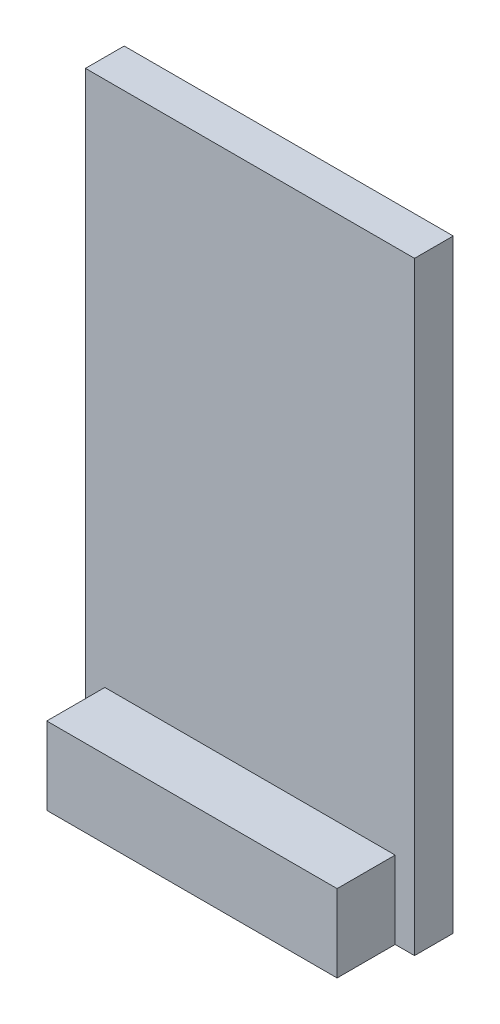
ISO-10303-21;
HEADER;
FILE_DESCRIPTION(('STEP AP214'),'2;1');
FILE_NAME('part.step','',(''),(''),'','','');
FILE_SCHEMA(('AUTOMOTIVE_DESIGN { 1 0 10303 214 1 1 1 1 }'));
ENDSEC;
DATA;
#1=APPLICATION_CONTEXT('core data for automotive mechanical design processes');
#2=APPLICATION_PROTOCOL_DEFINITION('international standard','automotive_design',2000,#1);
#3=PRODUCT_CONTEXT('',#1,'mechanical');
#4=PRODUCT('Part','Part','',(#3));
#5=PRODUCT_RELATED_PRODUCT_CATEGORY('part','',(#4));
#6=PRODUCT_DEFINITION_FORMATION('','',#4);
#7=PRODUCT_DEFINITION_CONTEXT('part definition',#1,'design');
#8=PRODUCT_DEFINITION('design','',#6,#7);
#9=PRODUCT_DEFINITION_SHAPE('','',#8);
#10=(LENGTH_UNIT() NAMED_UNIT(*) SI_UNIT(.MILLI.,.METRE.));
#11=(NAMED_UNIT(*) PLANE_ANGLE_UNIT() SI_UNIT($,.RADIAN.));
#12=(NAMED_UNIT(*) SI_UNIT($,.STERADIAN.) SOLID_ANGLE_UNIT());
#13=UNCERTAINTY_MEASURE_WITH_UNIT(LENGTH_MEASURE(1.E-05),#10,'distance_accuracy_value','');
#14=(GEOMETRIC_REPRESENTATION_CONTEXT(3) GLOBAL_UNCERTAINTY_ASSIGNED_CONTEXT((#13)) GLOBAL_UNIT_ASSIGNED_CONTEXT((#10,
#11,#12)) REPRESENTATION_CONTEXT('',''));
#15=CARTESIAN_POINT('',(0.,0.,0.));
#16=DIRECTION('',(0.,0.,1.));
#17=DIRECTION('',(1.,0.,0.));
#18=AXIS2_PLACEMENT_3D('',#15,#16,#17);
#19=CARTESIAN_POINT('',(0.,0.,0.));
#20=DIRECTION('',(0.,0.,1.));
#21=DIRECTION('',(1.,0.,0.));
#22=AXIS2_PLACEMENT_3D('',#19,#20,#21);
#23=PLANE('',#22);
#24=DIRECTION('',(0.,1.,0.));
#25=VECTOR('',#24,1.);
#26=CARTESIAN_POINT('',(8.5,-15.6,0.));
#27=LINE('',#26,#25);
#28=CARTESIAN_POINT('',(8.5,-15.6,0.));
#29=VERTEX_POINT('',#28);
#30=CARTESIAN_POINT('',(8.5,15.6,0.));
#31=VERTEX_POINT('',#30);
#32=EDGE_CURVE('P0_E25',#29,#31,#27,.T.);
#33=ORIENTED_EDGE('',*,*,#32,.F.);
#34=DIRECTION('',(1.,0.,0.));
#35=VECTOR('',#34,1.);
#36=CARTESIAN_POINT('',(-8.5,-15.6,0.));
#37=LINE('',#36,#35);
#38=CARTESIAN_POINT('',(-8.5,-15.6,0.));
#39=VERTEX_POINT('',#38);
#40=EDGE_CURVE('P0_E88',#39,#29,#37,.T.);
#41=ORIENTED_EDGE('',*,*,#40,.F.);
#42=DIRECTION('',(0.,-1.,0.));
#43=VECTOR('',#42,1.);
#44=CARTESIAN_POINT('',(-8.5,15.6,0.));
#45=LINE('',#44,#43);
#46=CARTESIAN_POINT('',(-8.5,15.6,0.));
#47=VERTEX_POINT('',#46);
#48=EDGE_CURVE('P0_E70',#47,#39,#45,.T.);
#49=ORIENTED_EDGE('',*,*,#48,.F.);
#50=DIRECTION('',(-1.,0.,0.));
#51=VECTOR('',#50,1.);
#52=CARTESIAN_POINT('',(8.5,15.6,0.));
#53=LINE('',#52,#51);
#54=EDGE_CURVE('P0_E111',#31,#47,#53,.T.);
#55=ORIENTED_EDGE('',*,*,#54,.F.);
#56=EDGE_LOOP('',(#33,#41,#49,#55));
#57=FACE_BOUND('',#56,.T.);
#58=ADVANCED_FACE('P0_F17',(#57),#23,.F.);
#59=CARTESIAN_POINT('',(0.,0.,2.));
#60=DIRECTION('',(0.,0.,1.));
#61=DIRECTION('',(1.,0.,0.));
#62=AXIS2_PLACEMENT_3D('',#59,#60,#61);
#63=PLANE('',#62);
#64=DIRECTION('',(0.,1.,0.));
#65=VECTOR('',#64,1.);
#66=CARTESIAN_POINT('',(8.5,-15.6,2.));
#67=LINE('',#66,#65);
#68=CARTESIAN_POINT('',(8.5,-15.6,2.));
#69=VERTEX_POINT('',#68);
#70=CARTESIAN_POINT('',(8.5,15.6,2.));
#71=VERTEX_POINT('',#70);
#72=EDGE_CURVE('P0_E11',#69,#71,#67,.T.);
#73=ORIENTED_EDGE('',*,*,#72,.T.);
#74=DIRECTION('',(-1.,0.,0.));
#75=VECTOR('',#74,1.);
#76=CARTESIAN_POINT('',(8.5,15.6,2.));
#77=LINE('',#76,#75);
#78=CARTESIAN_POINT('',(-8.5,15.6,2.));
#79=VERTEX_POINT('',#78);
#80=EDGE_CURVE('P0_E108',#71,#79,#77,.T.);
#81=ORIENTED_EDGE('',*,*,#80,.T.);
#82=DIRECTION('',(0.,-1.,0.));
#83=VECTOR('',#82,1.);
#84=CARTESIAN_POINT('',(-8.5,15.6,2.));
#85=LINE('',#84,#83);
#86=CARTESIAN_POINT('',(-8.5,-15.6,2.));
#87=VERTEX_POINT('',#86);
#88=EDGE_CURVE('P0_E82',#79,#87,#85,.T.);
#89=ORIENTED_EDGE('',*,*,#88,.T.);
#90=DIRECTION('',(1.,0.,0.));
#91=VECTOR('',#90,1.);
#92=CARTESIAN_POINT('',(-8.5,-15.6,2.));
#93=LINE('',#92,#91);
#94=EDGE_CURVE('P0_E89',#87,#69,#93,.T.);
#95=ORIENTED_EDGE('',*,*,#94,.T.);
#96=EDGE_LOOP('',(#73,#81,#89,#95));
#97=FACE_BOUND('',#96,.T.);
#98=ADVANCED_FACE('P0_F122',(#97),#63,.T.);
#99=CARTESIAN_POINT('',(8.5,-15.6,0.));
#100=DIRECTION('',(1.,0.,0.));
#101=DIRECTION('',(0.,1.,0.));
#102=AXIS2_PLACEMENT_3D('',#99,#100,#101);
#103=PLANE('',#102);
#104=ORIENTED_EDGE('',*,*,#32,.T.);
#105=DIRECTION('',(0.,0.,1.));
#106=VECTOR('',#105,1.);
#107=CARTESIAN_POINT('',(8.5,15.6,0.));
#108=LINE('',#107,#106);
#109=EDGE_CURVE('P0_E106',#31,#71,#108,.T.);
#110=ORIENTED_EDGE('',*,*,#109,.T.);
#111=ORIENTED_EDGE('',*,*,#72,.F.);
#112=DIRECTION('',(0.,0.,1.));
#113=VECTOR('',#112,1.);
#114=CARTESIAN_POINT('',(8.5,-15.6,0.));
#115=LINE('',#114,#113);
#116=EDGE_CURVE('P0_E93',#29,#69,#115,.T.);
#117=ORIENTED_EDGE('',*,*,#116,.F.);
#118=EDGE_LOOP('',(#104,#110,#111,#117));
#119=FACE_BOUND('',#118,.T.);
#120=ADVANCED_FACE('P0_F119',(#119),#103,.T.);
#121=CARTESIAN_POINT('',(8.5,15.6,0.));
#122=DIRECTION('',(0.,1.,0.));
#123=DIRECTION('',(1.,0.,0.));
#124=AXIS2_PLACEMENT_3D('',#121,#122,#123);
#125=PLANE('',#124);
#126=ORIENTED_EDGE('',*,*,#54,.T.);
#127=DIRECTION('',(0.,0.,1.));
#128=VECTOR('',#127,1.);
#129=CARTESIAN_POINT('',(-8.5,15.6,0.));
#130=LINE('',#129,#128);
#131=EDGE_CURVE('P0_E77',#47,#79,#130,.T.);
#132=ORIENTED_EDGE('',*,*,#131,.T.);
#133=ORIENTED_EDGE('',*,*,#80,.F.);
#134=ORIENTED_EDGE('',*,*,#109,.F.);
#135=EDGE_LOOP('',(#126,#132,#133,#134));
#136=FACE_BOUND('',#135,.T.);
#137=ADVANCED_FACE('P0_F121',(#136),#125,.T.);
#138=CARTESIAN_POINT('',(-8.5,15.6,0.));
#139=DIRECTION('',(-1.,0.,0.));
#140=DIRECTION('',(0.,0.,1.));
#141=AXIS2_PLACEMENT_3D('',#138,#139,#140);
#142=PLANE('',#141);
#143=ORIENTED_EDGE('',*,*,#48,.T.);
#144=DIRECTION('',(0.,0.,1.));
#145=VECTOR('',#144,1.);
#146=CARTESIAN_POINT('',(-8.5,-15.6,0.));
#147=LINE('',#146,#145);
#148=EDGE_CURVE('P0_E74',#39,#87,#147,.T.);
#149=ORIENTED_EDGE('',*,*,#148,.T.);
#150=ORIENTED_EDGE('',*,*,#88,.F.);
#151=ORIENTED_EDGE('',*,*,#131,.F.);
#152=EDGE_LOOP('',(#143,#149,#150,#151));
#153=FACE_BOUND('',#152,.T.);
#154=ADVANCED_FACE('P0_F72',(#153),#142,.T.);
#155=CARTESIAN_POINT('',(-8.5,-15.6,0.));
#156=DIRECTION('',(0.,-1.,0.));
#157=DIRECTION('',(0.,0.,-1.));
#158=AXIS2_PLACEMENT_3D('',#155,#156,#157);
#159=PLANE('',#158);
#160=ORIENTED_EDGE('',*,*,#40,.T.);
#161=ORIENTED_EDGE('',*,*,#116,.T.);
#162=ORIENTED_EDGE('',*,*,#94,.F.);
#163=ORIENTED_EDGE('',*,*,#148,.F.);
#164=EDGE_LOOP('',(#160,#161,#162,#163));
#165=FACE_BOUND('',#164,.T.);
#166=ADVANCED_FACE('P0_F86',(#165),#159,.T.);
#167=CLOSED_SHELL('',(#58,#98,#120,#137,#154,#166));
#168=MANIFOLD_SOLID_BREP('P0_B1',#167);
#169=CARTESIAN_POINT('',(0.,-13.6,2.));
#170=DIRECTION('',(0.,0.,1.));
#171=DIRECTION('',(1.,0.,0.));
#172=AXIS2_PLACEMENT_3D('',#169,#170,#171);
#173=PLANE('',#172);
#174=DIRECTION('',(0.,-1.,0.));
#175=VECTOR('',#174,1.);
#176=CARTESIAN_POINT('',(-7.5,-11.6,2.));
#177=LINE('',#176,#175);
#178=CARTESIAN_POINT('',(-7.5,-11.6,2.));
#179=VERTEX_POINT('',#178);
#180=CARTESIAN_POINT('',(-7.5,-15.6,2.));
#181=VERTEX_POINT('',#180);
#182=EDGE_CURVE('P1_E24',#179,#181,#177,.T.);
#183=ORIENTED_EDGE('',*,*,#182,.F.);
#184=DIRECTION('',(-1.,0.,0.));
#185=VECTOR('',#184,1.);
#186=CARTESIAN_POINT('',(7.5,-11.6,2.));
#187=LINE('',#186,#185);
#188=CARTESIAN_POINT('',(7.5,-11.6,2.));
#189=VERTEX_POINT('',#188);
#190=EDGE_CURVE('P1_E83',#189,#179,#187,.T.);
#191=ORIENTED_EDGE('',*,*,#190,.F.);
#192=DIRECTION('',(0.,1.,0.));
#193=VECTOR('',#192,1.);
#194=CARTESIAN_POINT('',(7.5,-15.6,2.));
#195=LINE('',#194,#193);
#196=CARTESIAN_POINT('',(7.5,-15.6,2.));
#197=VERTEX_POINT('',#196);
#198=EDGE_CURVE('P1_E94',#197,#189,#195,.T.);
#199=ORIENTED_EDGE('',*,*,#198,.F.);
#200=DIRECTION('',(1.,0.,0.));
#201=VECTOR('',#200,1.);
#202=CARTESIAN_POINT('',(-7.5,-15.6,2.));
#203=LINE('',#202,#201);
#204=EDGE_CURVE('P1_E103',#181,#197,#203,.T.);
#205=ORIENTED_EDGE('',*,*,#204,.F.);
#206=EDGE_LOOP('',(#183,#191,#199,#205));
#207=FACE_BOUND('',#206,.T.);
#208=ADVANCED_FACE('P1_F16',(#207),#173,.F.);
#209=CARTESIAN_POINT('',(0.,-13.6,5.));
#210=DIRECTION('',(0.,0.,1.));
#211=DIRECTION('',(1.,0.,0.));
#212=AXIS2_PLACEMENT_3D('',#209,#210,#211);
#213=PLANE('',#212);
#214=DIRECTION('',(0.,-1.,0.));
#215=VECTOR('',#214,1.);
#216=CARTESIAN_POINT('',(-7.5,-11.6,5.));
#217=LINE('',#216,#215);
#218=CARTESIAN_POINT('',(-7.5,-11.6,5.));
#219=VERTEX_POINT('',#218);
#220=CARTESIAN_POINT('',(-7.5,-15.6,5.));
#221=VERTEX_POINT('',#220);
#222=EDGE_CURVE('P1_E10',#219,#221,#217,.T.);
#223=ORIENTED_EDGE('',*,*,#222,.T.);
#224=DIRECTION('',(1.,0.,0.));
#225=VECTOR('',#224,1.);
#226=CARTESIAN_POINT('',(-7.5,-15.6,5.));
#227=LINE('',#226,#225);
#228=CARTESIAN_POINT('',(7.5,-15.6,5.));
#229=VERTEX_POINT('',#228);
#230=EDGE_CURVE('P1_E104',#221,#229,#227,.T.);
#231=ORIENTED_EDGE('',*,*,#230,.T.);
#232=DIRECTION('',(0.,1.,0.));
#233=VECTOR('',#232,1.);
#234=CARTESIAN_POINT('',(7.5,-15.6,5.));
#235=LINE('',#234,#233);
#236=CARTESIAN_POINT('',(7.5,-11.6,5.));
#237=VERTEX_POINT('',#236);
#238=EDGE_CURVE('P1_E74',#229,#237,#235,.T.);
#239=ORIENTED_EDGE('',*,*,#238,.T.);
#240=DIRECTION('',(-1.,0.,0.));
#241=VECTOR('',#240,1.);
#242=CARTESIAN_POINT('',(7.5,-11.6,5.));
#243=LINE('',#242,#241);
#244=EDGE_CURVE('P1_E71',#237,#219,#243,.T.);
#245=ORIENTED_EDGE('',*,*,#244,.T.);
#246=EDGE_LOOP('',(#223,#231,#239,#245));
#247=FACE_BOUND('',#246,.T.);
#248=ADVANCED_FACE('P1_F72',(#247),#213,.T.);
#249=CARTESIAN_POINT('',(-7.5,-11.6,2.));
#250=DIRECTION('',(-1.,0.,0.));
#251=DIRECTION('',(0.,0.,1.));
#252=AXIS2_PLACEMENT_3D('',#249,#250,#251);
#253=PLANE('',#252);
#254=ORIENTED_EDGE('',*,*,#182,.T.);
#255=DIRECTION('',(0.,0.,1.));
#256=VECTOR('',#255,1.);
#257=CARTESIAN_POINT('',(-7.5,-15.6,2.));
#258=LINE('',#257,#256);
#259=EDGE_CURVE('P1_E68',#181,#221,#258,.T.);
#260=ORIENTED_EDGE('',*,*,#259,.T.);
#261=ORIENTED_EDGE('',*,*,#222,.F.);
#262=DIRECTION('',(0.,0.,1.));
#263=VECTOR('',#262,1.);
#264=CARTESIAN_POINT('',(-7.5,-11.6,2.));
#265=LINE('',#264,#263);
#266=EDGE_CURVE('P1_E66',#179,#219,#265,.T.);
#267=ORIENTED_EDGE('',*,*,#266,.F.);
#268=EDGE_LOOP('',(#254,#260,#261,#267));
#269=FACE_BOUND('',#268,.T.);
#270=ADVANCED_FACE('P1_F64',(#269),#253,.T.);
#271=CARTESIAN_POINT('',(-7.5,-15.6,2.));
#272=DIRECTION('',(0.,-1.,0.));
#273=DIRECTION('',(0.,0.,-1.));
#274=AXIS2_PLACEMENT_3D('',#271,#272,#273);
#275=PLANE('',#274);
#276=ORIENTED_EDGE('',*,*,#204,.T.);
#277=DIRECTION('',(0.,0.,1.));
#278=VECTOR('',#277,1.);
#279=CARTESIAN_POINT('',(7.5,-15.6,2.));
#280=LINE('',#279,#278);
#281=EDGE_CURVE('P1_E99',#197,#229,#280,.T.);
#282=ORIENTED_EDGE('',*,*,#281,.T.);
#283=ORIENTED_EDGE('',*,*,#230,.F.);
#284=ORIENTED_EDGE('',*,*,#259,.F.);
#285=EDGE_LOOP('',(#276,#282,#283,#284));
#286=FACE_BOUND('',#285,.T.);
#287=ADVANCED_FACE('P1_F158',(#286),#275,.T.);
#288=CARTESIAN_POINT('',(7.5,-15.6,2.));
#289=DIRECTION('',(1.,0.,0.));
#290=DIRECTION('',(0.,1.,0.));
#291=AXIS2_PLACEMENT_3D('',#288,#289,#290);
#292=PLANE('',#291);
#293=ORIENTED_EDGE('',*,*,#198,.T.);
#294=DIRECTION('',(0.,0.,1.));
#295=VECTOR('',#294,1.);
#296=CARTESIAN_POINT('',(7.5,-11.6,2.));
#297=LINE('',#296,#295);
#298=EDGE_CURVE('P1_E79',#189,#237,#297,.T.);
#299=ORIENTED_EDGE('',*,*,#298,.T.);
#300=ORIENTED_EDGE('',*,*,#238,.F.);
#301=ORIENTED_EDGE('',*,*,#281,.F.);
#302=EDGE_LOOP('',(#293,#299,#300,#301));
#303=FACE_BOUND('',#302,.T.);
#304=ADVANCED_FACE('P1_F162',(#303),#292,.T.);
#305=CARTESIAN_POINT('',(7.5,-11.6,2.));
#306=DIRECTION('',(0.,1.,0.));
#307=DIRECTION('',(1.,0.,0.));
#308=AXIS2_PLACEMENT_3D('',#305,#306,#307);
#309=PLANE('',#308);
#310=ORIENTED_EDGE('',*,*,#190,.T.);
#311=ORIENTED_EDGE('',*,*,#266,.T.);
#312=ORIENTED_EDGE('',*,*,#244,.F.);
#313=ORIENTED_EDGE('',*,*,#298,.F.);
#314=EDGE_LOOP('',(#310,#311,#312,#313));
#315=FACE_BOUND('',#314,.T.);
#316=ADVANCED_FACE('P1_F81',(#315),#309,.T.);
#317=CLOSED_SHELL('',(#208,#248,#270,#287,#304,#316));
#318=MANIFOLD_SOLID_BREP('P1_B1',#317);
#319=ADVANCED_BREP_SHAPE_REPRESENTATION('',(#18,#168,#318),#14);
#320=SHAPE_DEFINITION_REPRESENTATION(#9,#319);
ENDSEC;
END-ISO-10303-21;
